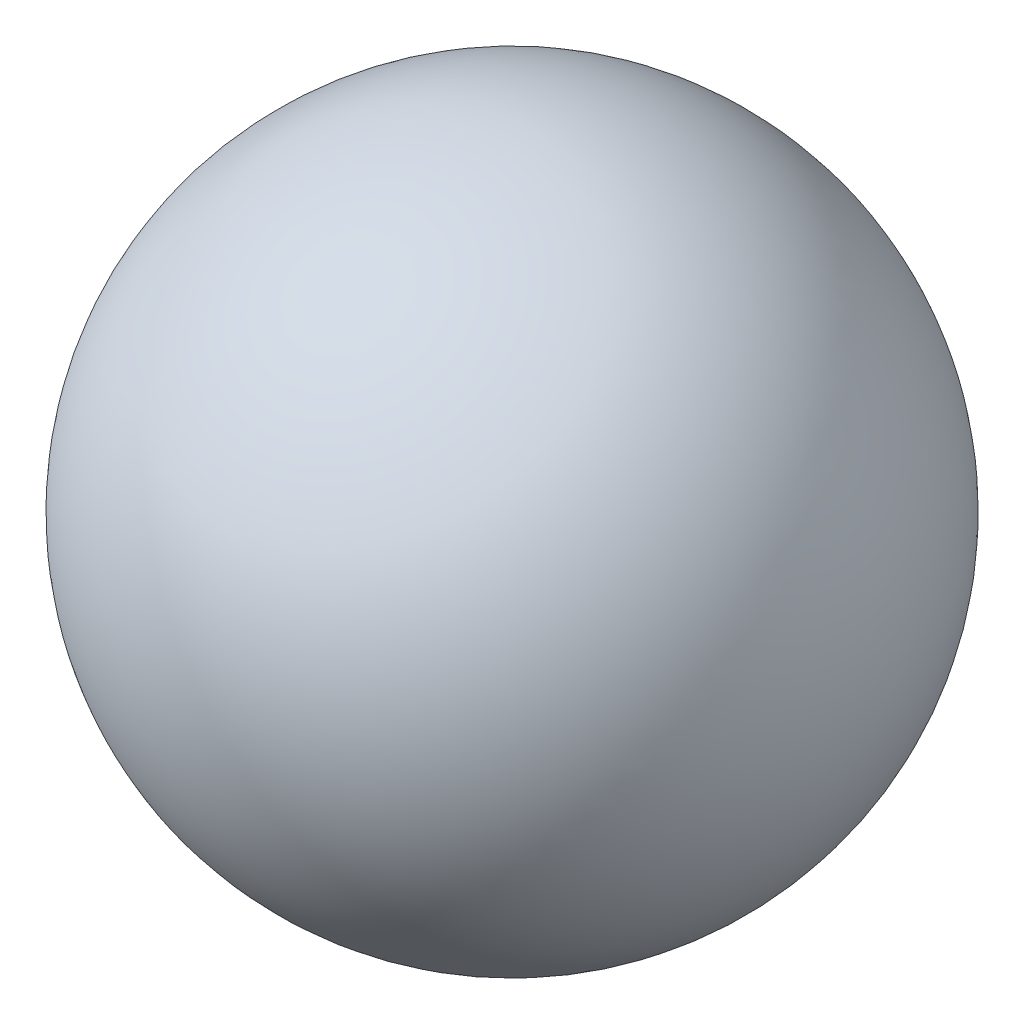
ISO-10303-21;
HEADER;
FILE_DESCRIPTION(('STEP AP214'),'2;1');
FILE_NAME('part.step','',(''),(''),'','','');
FILE_SCHEMA(('AUTOMOTIVE_DESIGN { 1 0 10303 214 1 1 1 1 }'));
ENDSEC;
DATA;
#1=APPLICATION_CONTEXT('core data for automotive mechanical design processes');
#2=APPLICATION_PROTOCOL_DEFINITION('international standard','automotive_design',2000,#1);
#3=PRODUCT_CONTEXT('',#1,'mechanical');
#4=PRODUCT('Part','Part','',(#3));
#5=PRODUCT_RELATED_PRODUCT_CATEGORY('part','',(#4));
#6=PRODUCT_DEFINITION_FORMATION('','',#4);
#7=PRODUCT_DEFINITION_CONTEXT('part definition',#1,'design');
#8=PRODUCT_DEFINITION('design','',#6,#7);
#9=PRODUCT_DEFINITION_SHAPE('','',#8);
#10=(LENGTH_UNIT() NAMED_UNIT(*) SI_UNIT(.MILLI.,.METRE.));
#11=(NAMED_UNIT(*) PLANE_ANGLE_UNIT() SI_UNIT($,.RADIAN.));
#12=(NAMED_UNIT(*) SI_UNIT($,.STERADIAN.) SOLID_ANGLE_UNIT());
#13=UNCERTAINTY_MEASURE_WITH_UNIT(LENGTH_MEASURE(1.E-05),#10,'distance_accuracy_value','');
#14=(GEOMETRIC_REPRESENTATION_CONTEXT(3) GLOBAL_UNCERTAINTY_ASSIGNED_CONTEXT((#13)) GLOBAL_UNIT_ASSIGNED_CONTEXT((#10,
#11,#12)) REPRESENTATION_CONTEXT('',''));
#15=CARTESIAN_POINT('',(0.,0.,0.));
#16=DIRECTION('',(0.,0.,1.));
#17=DIRECTION('',(1.,0.,0.));
#18=AXIS2_PLACEMENT_3D('',#15,#16,#17);
#19=CARTESIAN_POINT('',(0.,0.,0.));
#20=DIRECTION('',(0.,0.,1.));
#21=DIRECTION('',(-1.,0.,0.));
#22=AXIS2_PLACEMENT_3D('',#19,#20,#21);
#23=SPHERICAL_SURFACE('',#22,95.);
#24=CARTESIAN_POINT('',(0.,0.,95.));
#25=VERTEX_POINT('',#24);
#26=VERTEX_LOOP('',#25);
#27=FACE_BOUND('',#26,.T.);
#28=ADVANCED_FACE('F36',(#27),#23,.T.);
#29=CLOSED_SHELL('',(#28));
#30=MANIFOLD_SOLID_BREP('B2',#29);
#31=ADVANCED_BREP_SHAPE_REPRESENTATION('',(#18,#30),#14);
#32=SHAPE_DEFINITION_REPRESENTATION(#9,#31);
ENDSEC;
END-ISO-10303-21;
